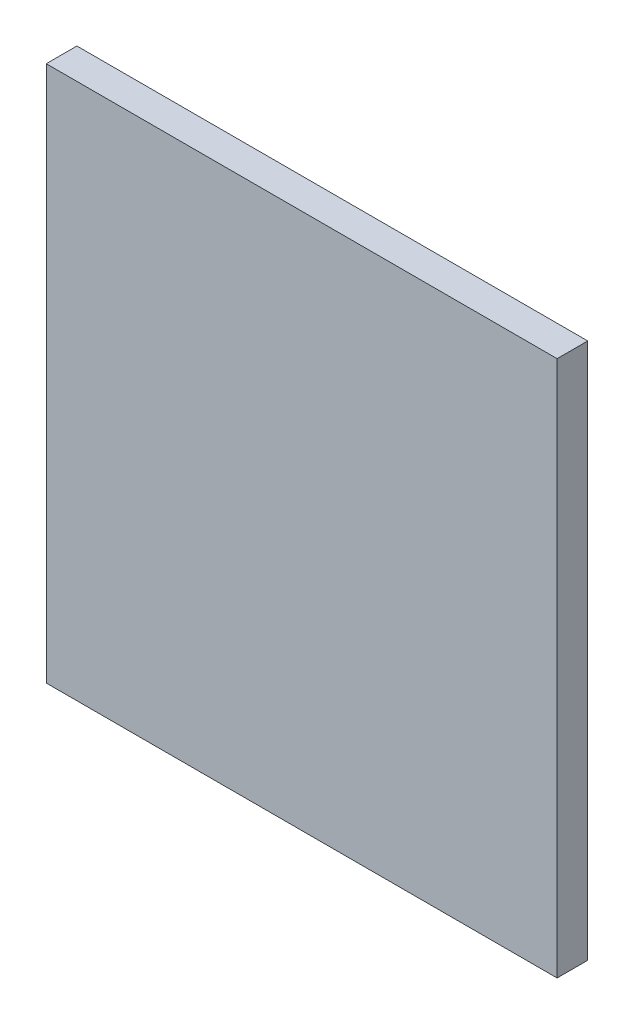
ISO-10303-21;
HEADER;
FILE_DESCRIPTION(('STEP AP214'),'2;1');
FILE_NAME('part.step','',(''),(''),'','','');
FILE_SCHEMA(('AUTOMOTIVE_DESIGN { 1 0 10303 214 1 1 1 1 }'));
ENDSEC;
DATA;
#1=APPLICATION_CONTEXT('core data for automotive mechanical design processes');
#2=APPLICATION_PROTOCOL_DEFINITION('international standard','automotive_design',2000,#1);
#3=PRODUCT_CONTEXT('',#1,'mechanical');
#4=PRODUCT('Part','Part','',(#3));
#5=PRODUCT_RELATED_PRODUCT_CATEGORY('part','',(#4));
#6=PRODUCT_DEFINITION_FORMATION('','',#4);
#7=PRODUCT_DEFINITION_CONTEXT('part definition',#1,'design');
#8=PRODUCT_DEFINITION('design','',#6,#7);
#9=PRODUCT_DEFINITION_SHAPE('','',#8);
#10=(LENGTH_UNIT() NAMED_UNIT(*) SI_UNIT(.MILLI.,.METRE.));
#11=(NAMED_UNIT(*) PLANE_ANGLE_UNIT() SI_UNIT($,.RADIAN.));
#12=(NAMED_UNIT(*) SI_UNIT($,.STERADIAN.) SOLID_ANGLE_UNIT());
#13=UNCERTAINTY_MEASURE_WITH_UNIT(LENGTH_MEASURE(1.E-05),#10,'distance_accuracy_value','');
#14=(GEOMETRIC_REPRESENTATION_CONTEXT(3) GLOBAL_UNCERTAINTY_ASSIGNED_CONTEXT((#13)) GLOBAL_UNIT_ASSIGNED_CONTEXT((#10,
#11,#12)) REPRESENTATION_CONTEXT('',''));
#15=CARTESIAN_POINT('',(0.,0.,0.));
#16=DIRECTION('',(0.,0.,1.));
#17=DIRECTION('',(1.,0.,0.));
#18=AXIS2_PLACEMENT_3D('',#15,#16,#17);
#19=CARTESIAN_POINT('',(15.,-15.75,1.8));
#20=DIRECTION('',(-1.,0.,0.));
#21=DIRECTION('',(0.,0.,1.));
#22=AXIS2_PLACEMENT_3D('',#19,#20,#21);
#23=PLANE('',#22);
#24=DIRECTION('',(0.,1.,0.));
#25=VECTOR('',#24,1.);
#26=CARTESIAN_POINT('',(15.,-15.75,0.));
#27=LINE('',#26,#25);
#28=CARTESIAN_POINT('',(15.,-15.75,0.));
#29=VERTEX_POINT('',#28);
#30=CARTESIAN_POINT('',(15.,15.75,0.));
#31=VERTEX_POINT('',#30);
#32=EDGE_CURVE('E98',#29,#31,#27,.T.);
#33=ORIENTED_EDGE('',*,*,#32,.T.);
#34=DIRECTION('',(0.,0.,-1.));
#35=VECTOR('',#34,1.);
#36=CARTESIAN_POINT('',(15.,15.75,1.8));
#37=LINE('',#36,#35);
#38=CARTESIAN_POINT('',(15.,15.75,1.8));
#39=VERTEX_POINT('',#38);
#40=EDGE_CURVE('E11',#39,#31,#37,.T.);
#41=ORIENTED_EDGE('',*,*,#40,.F.);
#42=DIRECTION('',(0.,1.,0.));
#43=VECTOR('',#42,1.);
#44=CARTESIAN_POINT('',(15.,-15.75,1.8));
#45=LINE('',#44,#43);
#46=CARTESIAN_POINT('',(15.,-15.75,1.8));
#47=VERTEX_POINT('',#46);
#48=EDGE_CURVE('E86',#47,#39,#45,.T.);
#49=ORIENTED_EDGE('',*,*,#48,.F.);
#50=DIRECTION('',(0.,0.,-1.));
#51=VECTOR('',#50,1.);
#52=CARTESIAN_POINT('',(15.,-15.75,1.8));
#53=LINE('',#52,#51);
#54=EDGE_CURVE('E94',#47,#29,#53,.T.);
#55=ORIENTED_EDGE('',*,*,#54,.T.);
#56=EDGE_LOOP('',(#33,#41,#49,#55));
#57=FACE_BOUND('',#56,.T.);
#58=ADVANCED_FACE('F35',(#57),#23,.F.);
#59=CARTESIAN_POINT('',(-15.,15.75,1.8));
#60=DIRECTION('',(0.,-1.,0.));
#61=DIRECTION('',(0.,0.,-1.));
#62=AXIS2_PLACEMENT_3D('',#59,#60,#61);
#63=PLANE('',#62);
#64=DIRECTION('',(-1.,0.,0.));
#65=VECTOR('',#64,1.);
#66=CARTESIAN_POINT('',(-15.,15.75,0.));
#67=LINE('',#66,#65);
#68=CARTESIAN_POINT('',(-15.,15.75,0.));
#69=VERTEX_POINT('',#68);
#70=EDGE_CURVE('E90',#31,#69,#67,.T.);
#71=ORIENTED_EDGE('',*,*,#70,.T.);
#72=DIRECTION('',(0.,0.,-1.));
#73=VECTOR('',#72,1.);
#74=CARTESIAN_POINT('',(-15.,15.75,1.8));
#75=LINE('',#74,#73);
#76=CARTESIAN_POINT('',(-15.,15.75,1.8));
#77=VERTEX_POINT('',#76);
#78=EDGE_CURVE('E43',#77,#69,#75,.T.);
#79=ORIENTED_EDGE('',*,*,#78,.F.);
#80=DIRECTION('',(-1.,0.,0.));
#81=VECTOR('',#80,1.);
#82=CARTESIAN_POINT('',(-15.,15.75,1.8));
#83=LINE('',#82,#81);
#84=EDGE_CURVE('E81',#39,#77,#83,.T.);
#85=ORIENTED_EDGE('',*,*,#84,.F.);
#86=ORIENTED_EDGE('',*,*,#40,.T.);
#87=EDGE_LOOP('',(#71,#79,#85,#86));
#88=FACE_BOUND('',#87,.T.);
#89=ADVANCED_FACE('F89',(#88),#63,.F.);
#90=CARTESIAN_POINT('',(-15.,-15.75,1.8));
#91=DIRECTION('',(1.,0.,0.));
#92=DIRECTION('',(0.,0.,-1.));
#93=AXIS2_PLACEMENT_3D('',#90,#91,#92);
#94=PLANE('',#93);
#95=DIRECTION('',(0.,-1.,0.));
#96=VECTOR('',#95,1.);
#97=CARTESIAN_POINT('',(-15.,-15.75,0.));
#98=LINE('',#97,#96);
#99=CARTESIAN_POINT('',(-15.,-15.75,0.));
#100=VERTEX_POINT('',#99);
#101=EDGE_CURVE('E68',#69,#100,#98,.T.);
#102=ORIENTED_EDGE('',*,*,#101,.T.);
#103=DIRECTION('',(0.,0.,-1.));
#104=VECTOR('',#103,1.);
#105=CARTESIAN_POINT('',(-15.,-15.75,1.8));
#106=LINE('',#105,#104);
#107=CARTESIAN_POINT('',(-15.,-15.75,1.8));
#108=VERTEX_POINT('',#107);
#109=EDGE_CURVE('E91',#108,#100,#106,.T.);
#110=ORIENTED_EDGE('',*,*,#109,.F.);
#111=DIRECTION('',(0.,-1.,0.));
#112=VECTOR('',#111,1.);
#113=CARTESIAN_POINT('',(-15.,-15.75,1.8));
#114=LINE('',#113,#112);
#115=EDGE_CURVE('E84',#77,#108,#114,.T.);
#116=ORIENTED_EDGE('',*,*,#115,.F.);
#117=ORIENTED_EDGE('',*,*,#78,.T.);
#118=EDGE_LOOP('',(#102,#110,#116,#117));
#119=FACE_BOUND('',#118,.T.);
#120=ADVANCED_FACE('F92',(#119),#94,.F.);
#121=CARTESIAN_POINT('',(-15.,-15.75,1.8));
#122=DIRECTION('',(0.,1.,0.));
#123=DIRECTION('',(0.,0.,1.));
#124=AXIS2_PLACEMENT_3D('',#121,#122,#123);
#125=PLANE('',#124);
#126=DIRECTION('',(1.,0.,0.));
#127=VECTOR('',#126,1.);
#128=CARTESIAN_POINT('',(-15.,-15.75,0.));
#129=LINE('',#128,#127);
#130=EDGE_CURVE('E74',#100,#29,#129,.T.);
#131=ORIENTED_EDGE('',*,*,#130,.T.);
#132=ORIENTED_EDGE('',*,*,#54,.F.);
#133=DIRECTION('',(1.,0.,0.));
#134=VECTOR('',#133,1.);
#135=CARTESIAN_POINT('',(-15.,-15.75,1.8));
#136=LINE('',#135,#134);
#137=EDGE_CURVE('E51',#108,#47,#136,.T.);
#138=ORIENTED_EDGE('',*,*,#137,.F.);
#139=ORIENTED_EDGE('',*,*,#109,.T.);
#140=EDGE_LOOP('',(#131,#132,#138,#139));
#141=FACE_BOUND('',#140,.T.);
#142=ADVANCED_FACE('F105',(#141),#125,.F.);
#143=CARTESIAN_POINT('',(0.,0.,1.8));
#144=DIRECTION('',(0.,0.,-1.));
#145=DIRECTION('',(-1.,0.,0.));
#146=AXIS2_PLACEMENT_3D('',#143,#144,#145);
#147=PLANE('',#146);
#148=ORIENTED_EDGE('',*,*,#48,.T.);
#149=ORIENTED_EDGE('',*,*,#84,.T.);
#150=ORIENTED_EDGE('',*,*,#115,.T.);
#151=ORIENTED_EDGE('',*,*,#137,.T.);
#152=EDGE_LOOP('',(#148,#149,#150,#151));
#153=FACE_BOUND('',#152,.T.);
#154=ADVANCED_FACE('F82',(#153),#147,.F.);
#155=CARTESIAN_POINT('',(0.,0.,0.));
#156=DIRECTION('',(0.,0.,-1.));
#157=DIRECTION('',(-1.,0.,0.));
#158=AXIS2_PLACEMENT_3D('',#155,#156,#157);
#159=PLANE('',#158);
#160=ORIENTED_EDGE('',*,*,#32,.F.);
#161=ORIENTED_EDGE('',*,*,#130,.F.);
#162=ORIENTED_EDGE('',*,*,#101,.F.);
#163=ORIENTED_EDGE('',*,*,#70,.F.);
#164=EDGE_LOOP('',(#160,#161,#162,#163));
#165=FACE_BOUND('',#164,.T.);
#166=ADVANCED_FACE('F108',(#165),#159,.T.);
#167=CLOSED_SHELL('',(#58,#89,#120,#142,#154,#166));
#168=MANIFOLD_SOLID_BREP('B2',#167);
#169=ADVANCED_BREP_SHAPE_REPRESENTATION('',(#18,#168),#14);
#170=SHAPE_DEFINITION_REPRESENTATION(#9,#169);
ENDSEC;
END-ISO-10303-21;
